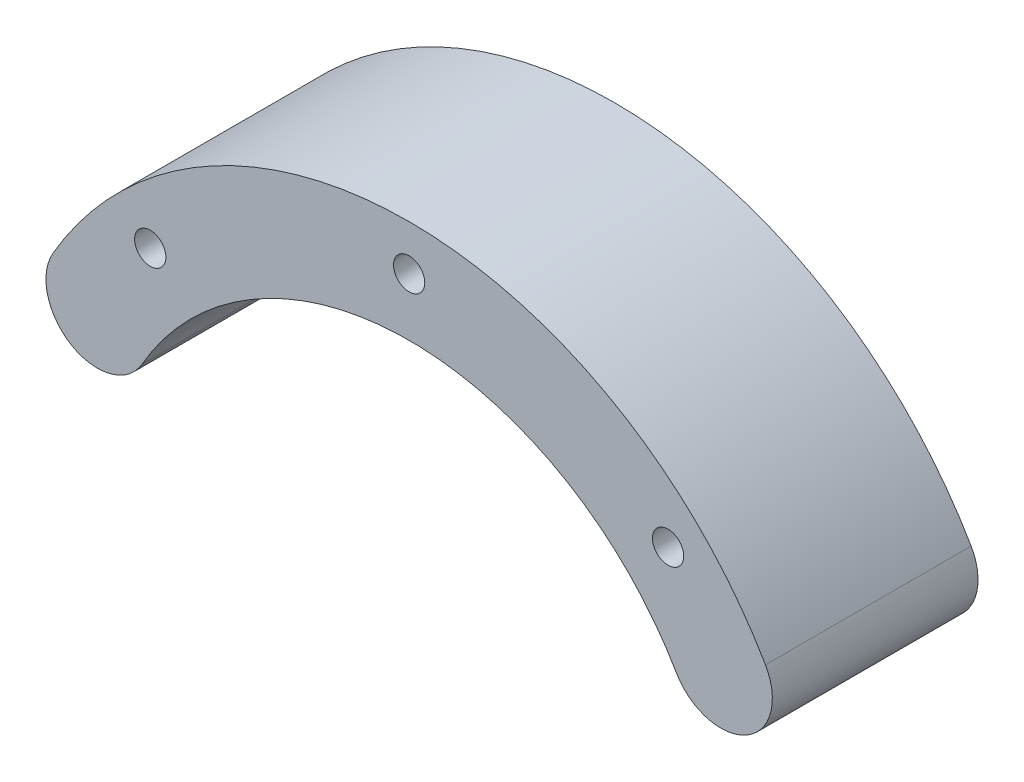
ISO-10303-21;
HEADER;
FILE_DESCRIPTION(('STEP AP214'),'2;1');
FILE_NAME('part.step','',(''),(''),'','','');
FILE_SCHEMA(('AUTOMOTIVE_DESIGN { 1 0 10303 214 1 1 1 1 }'));
ENDSEC;
DATA;
#1=APPLICATION_CONTEXT('core data for automotive mechanical design processes');
#2=APPLICATION_PROTOCOL_DEFINITION('international standard','automotive_design',2000,#1);
#3=PRODUCT_CONTEXT('',#1,'mechanical');
#4=PRODUCT('Part','Part','',(#3));
#5=PRODUCT_RELATED_PRODUCT_CATEGORY('part','',(#4));
#6=PRODUCT_DEFINITION_FORMATION('','',#4);
#7=PRODUCT_DEFINITION_CONTEXT('part definition',#1,'design');
#8=PRODUCT_DEFINITION('design','',#6,#7);
#9=PRODUCT_DEFINITION_SHAPE('','',#8);
#10=(LENGTH_UNIT() NAMED_UNIT(*) SI_UNIT(.MILLI.,.METRE.));
#11=(NAMED_UNIT(*) PLANE_ANGLE_UNIT() SI_UNIT($,.RADIAN.));
#12=(NAMED_UNIT(*) SI_UNIT($,.STERADIAN.) SOLID_ANGLE_UNIT());
#13=UNCERTAINTY_MEASURE_WITH_UNIT(LENGTH_MEASURE(1.E-05),#10,'distance_accuracy_value','');
#14=(GEOMETRIC_REPRESENTATION_CONTEXT(3) GLOBAL_UNCERTAINTY_ASSIGNED_CONTEXT((#13)) GLOBAL_UNIT_ASSIGNED_CONTEXT((#10,
#11,#12)) REPRESENTATION_CONTEXT('',''));
#15=CARTESIAN_POINT('',(0.,0.,0.));
#16=DIRECTION('',(0.,0.,1.));
#17=DIRECTION('',(1.,0.,0.));
#18=AXIS2_PLACEMENT_3D('',#15,#16,#17);
#19=CARTESIAN_POINT('',(-2.77175597797772,13.1752306771193,25.));
#20=DIRECTION('',(0.,0.,1.));
#21=DIRECTION('',(1.,0.,0.));
#22=AXIS2_PLACEMENT_3D('',#19,#20,#21);
#23=PLANE('',#22);
#24=CARTESIAN_POINT('',(16.1725497298072,46.7377306771199,25.));
#25=DIRECTION('',(0.,0.,1.));
#26=DIRECTION('',(1.,0.,0.));
#27=AXIS2_PLACEMENT_3D('',#24,#25,#26);
#28=CIRCLE('',#27,1.9);
#29=CARTESIAN_POINT('',(18.0725497298072,46.7377306771199,25.));
#30=VERTEX_POINT('',#29);
#31=EDGE_CURVE('E122',#30,#30,#28,.T.);
#32=ORIENTED_EDGE('',*,*,#31,.F.);
#33=EDGE_LOOP('',(#32));
#34=FACE_BOUND('',#33,.T.);
#35=CARTESIAN_POINT('',(-21.7160616857624,24.1127306771192,25.));
#36=DIRECTION('',(0.,0.,1.));
#37=DIRECTION('',(1.,0.,0.));
#38=AXIS2_PLACEMENT_3D('',#35,#36,#37);
#39=CIRCLE('',#38,6.25);
#40=CARTESIAN_POINT('',(-27.1287204594154,27.2377306771192,25.));
#41=VERTEX_POINT('',#40);
#42=CARTESIAN_POINT('',(-16.3034029121099,20.9877306771193,25.));
#43=VERTEX_POINT('',#42);
#44=EDGE_CURVE('E92',#41,#43,#39,.T.);
#45=ORIENTED_EDGE('',*,*,#44,.T.);
#46=CARTESIAN_POINT('',(16.172549729807,2.23773067711941,25.));
#47=DIRECTION('',(0.,0.,-1.));
#48=DIRECTION('',(1.,0.,0.));
#49=AXIS2_PLACEMENT_3D('',#46,#47,#48);
#50=CIRCLE('',#49,37.5000000000003);
#51=CARTESIAN_POINT('',(48.6485023717236,20.9877306771196,25.));
#52=VERTEX_POINT('',#51);
#53=EDGE_CURVE('E87',#43,#52,#50,.T.);
#54=ORIENTED_EDGE('',*,*,#53,.T.);
#55=CARTESIAN_POINT('',(54.0611611453766,24.1127306771197,25.));
#56=DIRECTION('',(0.,0.,1.));
#57=DIRECTION('',(-1.,0.,0.));
#58=AXIS2_PLACEMENT_3D('',#55,#56,#57);
#59=CIRCLE('',#58,6.24999999999999);
#60=CARTESIAN_POINT('',(59.4738199190293,27.2377306771196,25.));
#61=VERTEX_POINT('',#60);
#62=EDGE_CURVE('E90',#52,#61,#59,.T.);
#63=ORIENTED_EDGE('',*,*,#62,.T.);
#64=CARTESIAN_POINT('',(16.172549729807,2.23773067711941,25.));
#65=DIRECTION('',(0.,0.,1.));
#66=DIRECTION('',(1.,0.,0.));
#67=AXIS2_PLACEMENT_3D('',#64,#65,#66);
#68=CIRCLE('',#67,50.0000000000003);
#69=EDGE_CURVE('E57',#61,#41,#68,.T.);
#70=ORIENTED_EDGE('',*,*,#69,.T.);
#71=EDGE_LOOP('',(#45,#54,#63,#70));
#72=FACE_BOUND('',#71,.T.);
#73=CARTESIAN_POINT('',(-15.2937020329941,33.7039824399213,25.));
#74=DIRECTION('',(0.,0.,1.));
#75=DIRECTION('',(1.,0.,0.));
#76=AXIS2_PLACEMENT_3D('',#73,#74,#75);
#77=CIRCLE('',#76,1.9);
#78=CARTESIAN_POINT('',(-13.3937020329941,33.7039824399213,25.));
#79=VERTEX_POINT('',#78);
#80=EDGE_CURVE('E107',#79,#79,#77,.T.);
#81=ORIENTED_EDGE('',*,*,#80,.F.);
#82=EDGE_LOOP('',(#81));
#83=FACE_BOUND('',#82,.T.);
#84=CARTESIAN_POINT('',(47.6388014926088,33.7039824399211,25.));
#85=DIRECTION('',(0.,0.,1.));
#86=DIRECTION('',(1.,0.,0.));
#87=AXIS2_PLACEMENT_3D('',#84,#85,#86);
#88=CIRCLE('',#87,1.9);
#89=CARTESIAN_POINT('',(49.5388014926088,33.7039824399211,25.));
#90=VERTEX_POINT('',#89);
#91=EDGE_CURVE('E128',#90,#90,#88,.T.);
#92=ORIENTED_EDGE('',*,*,#91,.F.);
#93=EDGE_LOOP('',(#92));
#94=FACE_BOUND('',#93,.T.);
#95=ADVANCED_FACE('F40',(#34,#72,#83,#94),#23,.T.);
#96=CARTESIAN_POINT('',(-2.77175597797772,13.1752306771193,0.));
#97=DIRECTION('',(0.,0.,1.));
#98=DIRECTION('',(1.,0.,0.));
#99=AXIS2_PLACEMENT_3D('',#96,#97,#98);
#100=PLANE('',#99);
#101=CARTESIAN_POINT('',(-21.7160616857624,24.1127306771192,0.));
#102=DIRECTION('',(0.,0.,1.));
#103=DIRECTION('',(1.,0.,0.));
#104=AXIS2_PLACEMENT_3D('',#101,#102,#103);
#105=CIRCLE('',#104,6.25);
#106=CARTESIAN_POINT('',(-27.1287204594154,27.2377306771192,0.));
#107=VERTEX_POINT('',#106);
#108=CARTESIAN_POINT('',(-16.3034029121099,20.9877306771193,0.));
#109=VERTEX_POINT('',#108);
#110=EDGE_CURVE('E104',#107,#109,#105,.T.);
#111=ORIENTED_EDGE('',*,*,#110,.F.);
#112=CARTESIAN_POINT('',(16.172549729807,2.23773067711941,0.));
#113=DIRECTION('',(0.,0.,1.));
#114=DIRECTION('',(1.,0.,0.));
#115=AXIS2_PLACEMENT_3D('',#112,#113,#114);
#116=CIRCLE('',#115,50.0000000000003);
#117=CARTESIAN_POINT('',(59.4738199190293,27.2377306771196,0.));
#118=VERTEX_POINT('',#117);
#119=EDGE_CURVE('E80',#118,#107,#116,.T.);
#120=ORIENTED_EDGE('',*,*,#119,.F.);
#121=CARTESIAN_POINT('',(54.0611611453766,24.1127306771197,0.));
#122=DIRECTION('',(0.,0.,1.));
#123=DIRECTION('',(-1.,0.,0.));
#124=AXIS2_PLACEMENT_3D('',#121,#122,#123);
#125=CIRCLE('',#124,6.24999999999999);
#126=CARTESIAN_POINT('',(48.6485023717236,20.9877306771196,0.));
#127=VERTEX_POINT('',#126);
#128=EDGE_CURVE('E74',#127,#118,#125,.T.);
#129=ORIENTED_EDGE('',*,*,#128,.F.);
#130=CARTESIAN_POINT('',(16.172549729807,2.23773067711941,0.));
#131=DIRECTION('',(0.,0.,-1.));
#132=DIRECTION('',(1.,0.,0.));
#133=AXIS2_PLACEMENT_3D('',#130,#131,#132);
#134=CIRCLE('',#133,37.5000000000003);
#135=EDGE_CURVE('E96',#109,#127,#134,.T.);
#136=ORIENTED_EDGE('',*,*,#135,.F.);
#137=EDGE_LOOP('',(#111,#120,#129,#136));
#138=FACE_BOUND('',#137,.T.);
#139=CARTESIAN_POINT('',(-15.2937020329941,33.7039824399213,0.));
#140=DIRECTION('',(0.,0.,1.));
#141=DIRECTION('',(1.,0.,0.));
#142=AXIS2_PLACEMENT_3D('',#139,#140,#141);
#143=CIRCLE('',#142,1.9);
#144=CARTESIAN_POINT('',(-13.3937020329941,33.7039824399213,0.));
#145=VERTEX_POINT('',#144);
#146=EDGE_CURVE('E119',#145,#145,#143,.T.);
#147=ORIENTED_EDGE('',*,*,#146,.T.);
#148=EDGE_LOOP('',(#147));
#149=FACE_BOUND('',#148,.T.);
#150=CARTESIAN_POINT('',(16.1725497298072,46.7377306771199,0.));
#151=DIRECTION('',(0.,0.,1.));
#152=DIRECTION('',(1.,0.,0.));
#153=AXIS2_PLACEMENT_3D('',#150,#151,#152);
#154=CIRCLE('',#153,1.9);
#155=CARTESIAN_POINT('',(18.0725497298072,46.7377306771199,0.));
#156=VERTEX_POINT('',#155);
#157=EDGE_CURVE('E125',#156,#156,#154,.T.);
#158=ORIENTED_EDGE('',*,*,#157,.T.);
#159=EDGE_LOOP('',(#158));
#160=FACE_BOUND('',#159,.T.);
#161=CARTESIAN_POINT('',(47.6388014926088,33.7039824399211,0.));
#162=DIRECTION('',(0.,0.,1.));
#163=DIRECTION('',(1.,0.,0.));
#164=AXIS2_PLACEMENT_3D('',#161,#162,#163);
#165=CIRCLE('',#164,1.9);
#166=CARTESIAN_POINT('',(49.5388014926088,33.7039824399211,0.));
#167=VERTEX_POINT('',#166);
#168=EDGE_CURVE('E131',#167,#167,#165,.T.);
#169=ORIENTED_EDGE('',*,*,#168,.T.);
#170=EDGE_LOOP('',(#169));
#171=FACE_BOUND('',#170,.T.);
#172=ADVANCED_FACE('F115',(#138,#149,#160,#171),#100,.F.);
#173=CARTESIAN_POINT('',(-21.7160616857624,24.1127306771192,25.));
#174=DIRECTION('',(0.,0.,-1.));
#175=DIRECTION('',(-1.,0.,0.));
#176=AXIS2_PLACEMENT_3D('',#173,#174,#175);
#177=CYLINDRICAL_SURFACE('',#176,6.25);
#178=ORIENTED_EDGE('',*,*,#110,.T.);
#179=DIRECTION('',(0.,0.,-1.));
#180=VECTOR('',#179,1.);
#181=CARTESIAN_POINT('',(-16.3034029121099,20.9877306771193,25.));
#182=LINE('',#181,#180);
#183=EDGE_CURVE('E11',#43,#109,#182,.T.);
#184=ORIENTED_EDGE('',*,*,#183,.F.);
#185=ORIENTED_EDGE('',*,*,#44,.F.);
#186=DIRECTION('',(0.,0.,-1.));
#187=VECTOR('',#186,1.);
#188=CARTESIAN_POINT('',(-27.1287204594154,27.2377306771192,25.));
#189=LINE('',#188,#187);
#190=EDGE_CURVE('E100',#41,#107,#189,.T.);
#191=ORIENTED_EDGE('',*,*,#190,.T.);
#192=EDGE_LOOP('',(#178,#184,#185,#191));
#193=FACE_BOUND('',#192,.T.);
#194=ADVANCED_FACE('F42',(#193),#177,.T.);
#195=CARTESIAN_POINT('',(16.172549729807,2.23773067711941,25.));
#196=DIRECTION('',(0.,0.,-1.));
#197=DIRECTION('',(-1.,0.,0.));
#198=AXIS2_PLACEMENT_3D('',#195,#196,#197);
#199=CYLINDRICAL_SURFACE('',#198,37.5000000000003);
#200=ORIENTED_EDGE('',*,*,#135,.T.);
#201=DIRECTION('',(0.,0.,-1.));
#202=VECTOR('',#201,1.);
#203=CARTESIAN_POINT('',(48.6485023717236,20.9877306771196,25.));
#204=LINE('',#203,#202);
#205=EDGE_CURVE('E49',#52,#127,#204,.T.);
#206=ORIENTED_EDGE('',*,*,#205,.F.);
#207=ORIENTED_EDGE('',*,*,#53,.F.);
#208=ORIENTED_EDGE('',*,*,#183,.T.);
#209=EDGE_LOOP('',(#200,#206,#207,#208));
#210=FACE_BOUND('',#209,.T.);
#211=ADVANCED_FACE('F95',(#210),#199,.F.);
#212=CARTESIAN_POINT('',(54.0611611453766,24.1127306771197,25.));
#213=DIRECTION('',(0.,0.,-1.));
#214=DIRECTION('',(-1.,0.,0.));
#215=AXIS2_PLACEMENT_3D('',#212,#213,#214);
#216=CYLINDRICAL_SURFACE('',#215,6.24999999999999);
#217=ORIENTED_EDGE('',*,*,#128,.T.);
#218=DIRECTION('',(0.,0.,-1.));
#219=VECTOR('',#218,1.);
#220=CARTESIAN_POINT('',(59.4738199190293,27.2377306771196,25.));
#221=LINE('',#220,#219);
#222=EDGE_CURVE('E97',#61,#118,#221,.T.);
#223=ORIENTED_EDGE('',*,*,#222,.F.);
#224=ORIENTED_EDGE('',*,*,#62,.F.);
#225=ORIENTED_EDGE('',*,*,#205,.T.);
#226=EDGE_LOOP('',(#217,#223,#224,#225));
#227=FACE_BOUND('',#226,.T.);
#228=ADVANCED_FACE('F98',(#227),#216,.T.);
#229=CARTESIAN_POINT('',(16.172549729807,2.23773067711941,25.));
#230=DIRECTION('',(0.,0.,-1.));
#231=DIRECTION('',(-1.,0.,0.));
#232=AXIS2_PLACEMENT_3D('',#229,#230,#231);
#233=CYLINDRICAL_SURFACE('',#232,50.0000000000003);
#234=ORIENTED_EDGE('',*,*,#119,.T.);
#235=ORIENTED_EDGE('',*,*,#190,.F.);
#236=ORIENTED_EDGE('',*,*,#69,.F.);
#237=ORIENTED_EDGE('',*,*,#222,.T.);
#238=EDGE_LOOP('',(#234,#235,#236,#237));
#239=FACE_BOUND('',#238,.T.);
#240=ADVANCED_FACE('F112',(#239),#233,.T.);
#241=CARTESIAN_POINT('',(-15.2937020329941,33.7039824399213,25.));
#242=DIRECTION('',(0.,0.,-1.));
#243=DIRECTION('',(-1.,0.,0.));
#244=AXIS2_PLACEMENT_3D('',#241,#242,#243);
#245=CYLINDRICAL_SURFACE('',#244,1.9);
#246=ORIENTED_EDGE('',*,*,#80,.T.);
#247=EDGE_LOOP('',(#246));
#248=FACE_BOUND('',#247,.T.);
#249=ORIENTED_EDGE('',*,*,#146,.F.);
#250=EDGE_LOOP('',(#249));
#251=FACE_BOUND('',#250,.T.);
#252=ADVANCED_FACE('F149',(#248,#251),#245,.F.);
#253=CARTESIAN_POINT('',(16.1725497298072,46.7377306771199,25.));
#254=DIRECTION('',(0.,0.,-1.));
#255=DIRECTION('',(-1.,0.,0.));
#256=AXIS2_PLACEMENT_3D('',#253,#254,#255);
#257=CYLINDRICAL_SURFACE('',#256,1.9);
#258=ORIENTED_EDGE('',*,*,#31,.T.);
#259=EDGE_LOOP('',(#258));
#260=FACE_BOUND('',#259,.T.);
#261=ORIENTED_EDGE('',*,*,#157,.F.);
#262=EDGE_LOOP('',(#261));
#263=FACE_BOUND('',#262,.T.);
#264=ADVANCED_FACE('F203',(#260,#263),#257,.F.);
#265=CARTESIAN_POINT('',(47.6388014926088,33.7039824399211,25.));
#266=DIRECTION('',(0.,0.,-1.));
#267=DIRECTION('',(-1.,0.,0.));
#268=AXIS2_PLACEMENT_3D('',#265,#266,#267);
#269=CYLINDRICAL_SURFACE('',#268,1.9);
#270=ORIENTED_EDGE('',*,*,#91,.T.);
#271=EDGE_LOOP('',(#270));
#272=FACE_BOUND('',#271,.T.);
#273=ORIENTED_EDGE('',*,*,#168,.F.);
#274=EDGE_LOOP('',(#273));
#275=FACE_BOUND('',#274,.T.);
#276=ADVANCED_FACE('F137',(#272,#275),#269,.F.);
#277=CLOSED_SHELL('',(#95,#172,#194,#211,#228,#240,#252,#264,#276));
#278=MANIFOLD_SOLID_BREP('B2',#277);
#279=ADVANCED_BREP_SHAPE_REPRESENTATION('',(#18,#278),#14);
#280=SHAPE_DEFINITION_REPRESENTATION(#9,#279);
ENDSEC;
END-ISO-10303-21;
